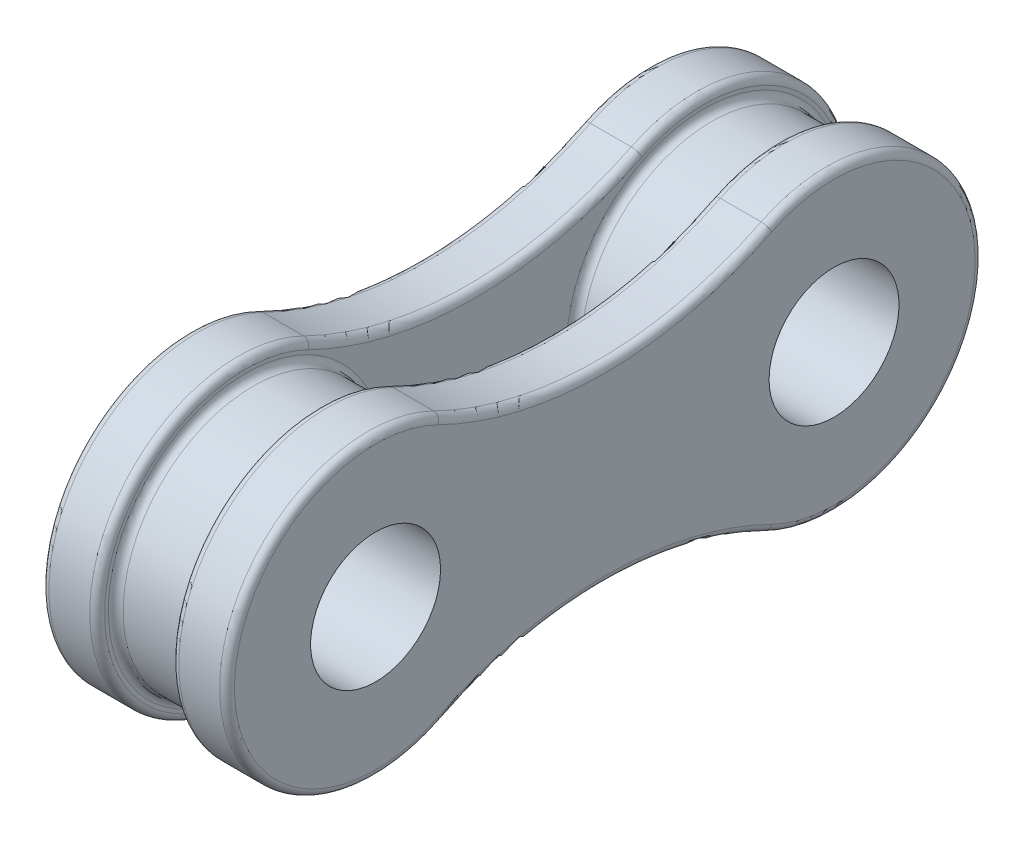
ISO-10303-21;
HEADER;
FILE_DESCRIPTION(('STEP AP214'),'2;1');
FILE_NAME('part.step','',(''),(''),'','','');
FILE_SCHEMA(('AUTOMOTIVE_DESIGN { 1 0 10303 214 1 1 1 1 }'));
ENDSEC;
DATA;
#1=APPLICATION_CONTEXT('core data for automotive mechanical design processes');
#2=APPLICATION_PROTOCOL_DEFINITION('international standard','automotive_design',2000,#1);
#3=PRODUCT_CONTEXT('',#1,'mechanical');
#4=PRODUCT('Part','Part','',(#3));
#5=PRODUCT_RELATED_PRODUCT_CATEGORY('part','',(#4));
#6=PRODUCT_DEFINITION_FORMATION('','',#4);
#7=PRODUCT_DEFINITION_CONTEXT('part definition',#1,'design');
#8=PRODUCT_DEFINITION('design','',#6,#7);
#9=PRODUCT_DEFINITION_SHAPE('','',#8);
#10=(LENGTH_UNIT() NAMED_UNIT(*) SI_UNIT(.MILLI.,.METRE.));
#11=(NAMED_UNIT(*) PLANE_ANGLE_UNIT() SI_UNIT($,.RADIAN.));
#12=(NAMED_UNIT(*) SI_UNIT($,.STERADIAN.) SOLID_ANGLE_UNIT());
#13=UNCERTAINTY_MEASURE_WITH_UNIT(LENGTH_MEASURE(1.E-05),#10,'distance_accuracy_value','');
#14=(GEOMETRIC_REPRESENTATION_CONTEXT(3) GLOBAL_UNCERTAINTY_ASSIGNED_CONTEXT((#13)) GLOBAL_UNIT_ASSIGNED_CONTEXT((#10,
#11,#12)) REPRESENTATION_CONTEXT('',''));
#15=CARTESIAN_POINT('',(0.,0.,0.));
#16=DIRECTION('',(0.,0.,1.));
#17=DIRECTION('',(1.,0.,0.));
#18=AXIS2_PLACEMENT_3D('',#15,#16,#17);
#19=CARTESIAN_POINT('',(2.5,6.2823040160438,-3.0875));
#20=DIRECTION('',(1.,0.,0.));
#21=DIRECTION('',(0.,0.,-1.));
#22=AXIS2_PLACEMENT_3D('',#19,#20,#21);
#23=PLANE('',#22);
#24=CARTESIAN_POINT('',(2.5,-12.5646080320876,0.));
#25=DIRECTION('',(1.,0.,0.));
#26=DIRECTION('',(0.,0.,-1.));
#27=AXIS2_PLACEMENT_3D('',#24,#25,#26);
#28=CIRCLE('',#27,10.2);
#29=CARTESIAN_POINT('',(2.5,-3.41039360870949,4.49892857142857));
#30=VERTEX_POINT('',#29);
#31=CARTESIAN_POINT('',(2.5,-3.41039360870949,-4.49892857142857));
#32=VERTEX_POINT('',#31);
#33=EDGE_CURVE('E191',#30,#32,#28,.F.);
#34=ORIENTED_EDGE('',*,*,#33,.T.);
#35=CARTESIAN_POINT('',(2.5,0.,-6.175));
#36=DIRECTION('',(1.,0.,0.));
#37=DIRECTION('',(0.,0.,-1.));
#38=AXIS2_PLACEMENT_3D('',#35,#36,#37);
#39=CIRCLE('',#38,3.8);
#40=CARTESIAN_POINT('',(2.5,3.41039360870949,-4.49892857142857));
#41=VERTEX_POINT('',#40);
#42=EDGE_CURVE('E171',#32,#41,#39,.T.);
#43=ORIENTED_EDGE('',*,*,#42,.T.);
#44=CARTESIAN_POINT('',(2.5,12.5646080320876,0.));
#45=DIRECTION('',(1.,0.,0.));
#46=DIRECTION('',(0.,0.,-1.));
#47=AXIS2_PLACEMENT_3D('',#44,#45,#46);
#48=CIRCLE('',#47,10.2);
#49=CARTESIAN_POINT('',(2.5,3.41039360870949,4.49892857142857));
#50=VERTEX_POINT('',#49);
#51=EDGE_CURVE('E180',#41,#50,#48,.F.);
#52=ORIENTED_EDGE('',*,*,#51,.T.);
#53=CARTESIAN_POINT('',(2.5,0.,6.175));
#54=DIRECTION('',(1.,0.,0.));
#55=DIRECTION('',(0.,0.,-1.));
#56=AXIS2_PLACEMENT_3D('',#53,#54,#55);
#57=CIRCLE('',#56,3.8);
#58=EDGE_CURVE('E186',#50,#30,#57,.T.);
#59=ORIENTED_EDGE('',*,*,#58,.T.);
#60=EDGE_LOOP('',(#34,#43,#52,#59));
#61=FACE_BOUND('',#60,.T.);
#62=CARTESIAN_POINT('',(2.5,0.,6.175));
#63=DIRECTION('',(1.,0.,0.));
#64=DIRECTION('',(0.,0.,-1.));
#65=AXIS2_PLACEMENT_3D('',#62,#63,#64);
#66=CIRCLE('',#65,1.75);
#67=CARTESIAN_POINT('',(2.5,0.,4.425));
#68=VERTEX_POINT('',#67);
#69=EDGE_CURVE('E641',#68,#68,#66,.T.);
#70=ORIENTED_EDGE('',*,*,#69,.F.);
#71=EDGE_LOOP('',(#70));
#72=FACE_BOUND('',#71,.T.);
#73=CARTESIAN_POINT('',(2.5,0.,-6.175));
#74=DIRECTION('',(1.,0.,0.));
#75=DIRECTION('',(0.,0.,1.));
#76=AXIS2_PLACEMENT_3D('',#73,#74,#75);
#77=CIRCLE('',#76,1.75);
#78=CARTESIAN_POINT('',(2.5,0.,-4.425));
#79=VERTEX_POINT('',#78);
#80=EDGE_CURVE('E643',#79,#79,#77,.T.);
#81=ORIENTED_EDGE('',*,*,#80,.F.);
#82=EDGE_LOOP('',(#81));
#83=FACE_BOUND('',#82,.T.);
#84=ADVANCED_FACE('F51',(#61,#72,#83),#23,.T.);
#85=CARTESIAN_POINT('',(1.,6.2823040160438,-3.0875));
#86=DIRECTION('',(1.,0.,0.));
#87=DIRECTION('',(0.,0.,-1.));
#88=AXIS2_PLACEMENT_3D('',#85,#86,#87);
#89=PLANE('',#88);
#90=CARTESIAN_POINT('',(1.,-12.5646080320876,0.));
#91=DIRECTION('',(1.,0.,0.));
#92=DIRECTION('',(0.,0.,-1.));
#93=AXIS2_PLACEMENT_3D('',#90,#91,#92);
#94=CIRCLE('',#93,10.2);
#95=CARTESIAN_POINT('',(1.,-3.41039360870949,-4.49892857142857));
#96=VERTEX_POINT('',#95);
#97=CARTESIAN_POINT('',(1.,-3.41039360870949,4.49892857142857));
#98=VERTEX_POINT('',#97);
#99=EDGE_CURVE('E219',#96,#98,#94,.T.);
#100=ORIENTED_EDGE('',*,*,#99,.T.);
#101=CARTESIAN_POINT('',(1.,0.,6.175));
#102=DIRECTION('',(1.,0.,0.));
#103=DIRECTION('',(0.,0.,-1.));
#104=AXIS2_PLACEMENT_3D('',#101,#102,#103);
#105=CIRCLE('',#104,3.8);
#106=CARTESIAN_POINT('',(1.,3.41039360870949,4.49892857142857));
#107=VERTEX_POINT('',#106);
#108=EDGE_CURVE('E221',#98,#107,#105,.F.);
#109=ORIENTED_EDGE('',*,*,#108,.T.);
#110=CARTESIAN_POINT('',(1.,12.5646080320876,0.));
#111=DIRECTION('',(1.,0.,0.));
#112=DIRECTION('',(0.,0.,-1.));
#113=AXIS2_PLACEMENT_3D('',#110,#111,#112);
#114=CIRCLE('',#113,10.2);
#115=CARTESIAN_POINT('',(1.,3.41039360870949,-4.49892857142857));
#116=VERTEX_POINT('',#115);
#117=EDGE_CURVE('E215',#107,#116,#114,.T.);
#118=ORIENTED_EDGE('',*,*,#117,.T.);
#119=CARTESIAN_POINT('',(1.,0.,-6.175));
#120=DIRECTION('',(1.,0.,0.));
#121=DIRECTION('',(0.,0.,-1.));
#122=AXIS2_PLACEMENT_3D('',#119,#120,#121);
#123=CIRCLE('',#122,3.8);
#124=EDGE_CURVE('E217',#116,#96,#123,.F.);
#125=ORIENTED_EDGE('',*,*,#124,.T.);
#126=EDGE_LOOP('',(#100,#109,#118,#125));
#127=FACE_BOUND('',#126,.T.);
#128=CARTESIAN_POINT('',(1.,0.,-6.175));
#129=DIRECTION('',(1.,0.,0.));
#130=DIRECTION('',(0.,0.,-1.));
#131=AXIS2_PLACEMENT_3D('',#128,#129,#130);
#132=CIRCLE('',#131,3.7);
#133=CARTESIAN_POINT('',(1.,0.,-9.875));
#134=VERTEX_POINT('',#133);
#135=EDGE_CURVE('E212',#134,#134,#132,.T.);
#136=ORIENTED_EDGE('',*,*,#135,.T.);
#137=EDGE_LOOP('',(#136));
#138=FACE_BOUND('',#137,.T.);
#139=CARTESIAN_POINT('',(1.,0.,6.175));
#140=DIRECTION('',(1.,0.,0.));
#141=DIRECTION('',(0.,0.,-1.));
#142=AXIS2_PLACEMENT_3D('',#139,#140,#141);
#143=CIRCLE('',#142,3.7);
#144=CARTESIAN_POINT('',(1.,0.,2.475));
#145=VERTEX_POINT('',#144);
#146=EDGE_CURVE('E209',#145,#145,#143,.T.);
#147=ORIENTED_EDGE('',*,*,#146,.T.);
#148=EDGE_LOOP('',(#147));
#149=FACE_BOUND('',#148,.T.);
#150=ADVANCED_FACE('F353',(#127,#138,#149),#89,.F.);
#151=CARTESIAN_POINT('',(2.5,12.5646080320876,0.));
#152=DIRECTION('',(-1.,0.,0.));
#153=DIRECTION('',(0.,0.,1.));
#154=AXIS2_PLACEMENT_3D('',#151,#152,#153);
#155=CYLINDRICAL_SURFACE('',#154,10.);
#156=DIRECTION('',(-1.,0.,0.));
#157=VECTOR('',#156,1.);
#158=CARTESIAN_POINT('',(2.5,3.58988800916788,-4.41071428571429));
#159=LINE('',#158,#157);
#160=CARTESIAN_POINT('',(2.3,3.58988800916788,-4.41071428571429));
#161=VERTEX_POINT('',#160);
#162=CARTESIAN_POINT('',(1.2,3.58988800916788,-4.41071428571429));
#163=VERTEX_POINT('',#162);
#164=EDGE_CURVE('E642',#161,#163,#159,.T.);
#165=ORIENTED_EDGE('',*,*,#164,.T.);
#166=CARTESIAN_POINT('',(1.2,12.5646080320876,0.));
#167=DIRECTION('',(1.,0.,0.));
#168=DIRECTION('',(0.,0.,-1.));
#169=AXIS2_PLACEMENT_3D('',#166,#167,#168);
#170=CIRCLE('',#169,10.);
#171=CARTESIAN_POINT('',(1.2,3.58988800916788,4.41071428571429));
#172=VERTEX_POINT('',#171);
#173=EDGE_CURVE('E226',#163,#172,#170,.F.);
#174=ORIENTED_EDGE('',*,*,#173,.T.);
#175=DIRECTION('',(-1.,0.,0.));
#176=VECTOR('',#175,1.);
#177=CARTESIAN_POINT('',(2.5,3.58988800916788,4.41071428571429));
#178=LINE('',#177,#176);
#179=CARTESIAN_POINT('',(2.3,3.58988800916788,4.41071428571429));
#180=VERTEX_POINT('',#179);
#181=EDGE_CURVE('E187',#180,#172,#178,.T.);
#182=ORIENTED_EDGE('',*,*,#181,.F.);
#183=CARTESIAN_POINT('',(2.3,12.5646080320876,0.));
#184=DIRECTION('',(1.,0.,0.));
#185=DIRECTION('',(0.,0.,-1.));
#186=AXIS2_PLACEMENT_3D('',#183,#184,#185);
#187=CIRCLE('',#186,10.);
#188=EDGE_CURVE('E224',#180,#161,#187,.T.);
#189=ORIENTED_EDGE('',*,*,#188,.T.);
#190=EDGE_LOOP('',(#165,#174,#182,#189));
#191=FACE_BOUND('',#190,.T.);
#192=ADVANCED_FACE('F358',(#191),#155,.F.);
#193=CARTESIAN_POINT('',(2.5,0.,6.175));
#194=DIRECTION('',(-1.,0.,0.));
#195=DIRECTION('',(0.,0.,1.));
#196=AXIS2_PLACEMENT_3D('',#193,#194,#195);
#197=CYLINDRICAL_SURFACE('',#196,4.);
#198=DIRECTION('',(-1.,0.,0.));
#199=VECTOR('',#198,1.);
#200=CARTESIAN_POINT('',(2.5,-3.58988800916788,4.41071428571429));
#201=LINE('',#200,#199);
#202=CARTESIAN_POINT('',(2.3,-3.58988800916788,4.41071428571429));
#203=VERTEX_POINT('',#202);
#204=CARTESIAN_POINT('',(1.2,-3.58988800916788,4.41071428571429));
#205=VERTEX_POINT('',#204);
#206=EDGE_CURVE('E655',#203,#205,#201,.T.);
#207=ORIENTED_EDGE('',*,*,#206,.F.);
#208=CARTESIAN_POINT('',(2.3,0.,6.175));
#209=DIRECTION('',(1.,0.,0.));
#210=DIRECTION('',(0.,0.,-1.));
#211=AXIS2_PLACEMENT_3D('',#208,#209,#210);
#212=CIRCLE('',#211,4.);
#213=EDGE_CURVE('E207',#203,#180,#212,.F.);
#214=ORIENTED_EDGE('',*,*,#213,.T.);
#215=ORIENTED_EDGE('',*,*,#181,.T.);
#216=CARTESIAN_POINT('',(1.2,0.,6.175));
#217=DIRECTION('',(1.,0.,0.));
#218=DIRECTION('',(0.,0.,-1.));
#219=AXIS2_PLACEMENT_3D('',#216,#217,#218);
#220=CIRCLE('',#219,4.);
#221=EDGE_CURVE('E204',#172,#205,#220,.T.);
#222=ORIENTED_EDGE('',*,*,#221,.T.);
#223=EDGE_LOOP('',(#207,#214,#215,#222));
#224=FACE_BOUND('',#223,.T.);
#225=ADVANCED_FACE('F372',(#224),#197,.T.);
#226=CARTESIAN_POINT('',(2.5,-12.5646080320876,0.));
#227=DIRECTION('',(-1.,0.,0.));
#228=DIRECTION('',(0.,0.,1.));
#229=AXIS2_PLACEMENT_3D('',#226,#227,#228);
#230=CYLINDRICAL_SURFACE('',#229,10.);
#231=DIRECTION('',(-1.,0.,0.));
#232=VECTOR('',#231,1.);
#233=CARTESIAN_POINT('',(2.5,-3.58988800916788,-4.41071428571429));
#234=LINE('',#233,#232);
#235=CARTESIAN_POINT('',(2.3,-3.58988800916788,-4.41071428571429));
#236=VERTEX_POINT('',#235);
#237=CARTESIAN_POINT('',(1.2,-3.58988800916788,-4.41071428571429));
#238=VERTEX_POINT('',#237);
#239=EDGE_CURVE('E646',#236,#238,#234,.T.);
#240=ORIENTED_EDGE('',*,*,#239,.F.);
#241=CARTESIAN_POINT('',(2.3,-12.5646080320876,0.));
#242=DIRECTION('',(1.,0.,0.));
#243=DIRECTION('',(0.,0.,-1.));
#244=AXIS2_PLACEMENT_3D('',#241,#242,#243);
#245=CIRCLE('',#244,10.);
#246=EDGE_CURVE('E202',#236,#203,#245,.T.);
#247=ORIENTED_EDGE('',*,*,#246,.T.);
#248=ORIENTED_EDGE('',*,*,#206,.T.);
#249=CARTESIAN_POINT('',(1.2,-12.5646080320876,0.));
#250=DIRECTION('',(1.,0.,0.));
#251=DIRECTION('',(0.,0.,-1.));
#252=AXIS2_PLACEMENT_3D('',#249,#250,#251);
#253=CIRCLE('',#252,10.);
#254=EDGE_CURVE('E200',#205,#238,#253,.F.);
#255=ORIENTED_EDGE('',*,*,#254,.T.);
#256=EDGE_LOOP('',(#240,#247,#248,#255));
#257=FACE_BOUND('',#256,.T.);
#258=ADVANCED_FACE('F368',(#257),#230,.F.);
#259=CARTESIAN_POINT('',(2.5,0.,-6.175));
#260=DIRECTION('',(-1.,0.,0.));
#261=DIRECTION('',(0.,0.,1.));
#262=AXIS2_PLACEMENT_3D('',#259,#260,#261);
#263=CYLINDRICAL_SURFACE('',#262,4.);
#264=ORIENTED_EDGE('',*,*,#164,.F.);
#265=CARTESIAN_POINT('',(2.3,0.,-6.175));
#266=DIRECTION('',(1.,0.,0.));
#267=DIRECTION('',(0.,0.,-1.));
#268=AXIS2_PLACEMENT_3D('',#265,#266,#267);
#269=CIRCLE('',#268,4.);
#270=EDGE_CURVE('E173',#161,#236,#269,.F.);
#271=ORIENTED_EDGE('',*,*,#270,.T.);
#272=ORIENTED_EDGE('',*,*,#239,.T.);
#273=CARTESIAN_POINT('',(1.2,0.,-6.175));
#274=DIRECTION('',(1.,0.,0.));
#275=DIRECTION('',(0.,0.,-1.));
#276=AXIS2_PLACEMENT_3D('',#273,#274,#275);
#277=CIRCLE('',#276,4.);
#278=EDGE_CURVE('E193',#238,#163,#277,.T.);
#279=ORIENTED_EDGE('',*,*,#278,.T.);
#280=EDGE_LOOP('',(#264,#271,#272,#279));
#281=FACE_BOUND('',#280,.T.);
#282=ADVANCED_FACE('F365',(#281),#263,.T.);
#283=CARTESIAN_POINT('',(2.5,0.,6.175));
#284=DIRECTION('',(-1.,0.,0.));
#285=DIRECTION('',(0.,0.,1.));
#286=AXIS2_PLACEMENT_3D('',#283,#284,#285);
#287=CYLINDRICAL_SURFACE('',#286,1.75);
#288=CARTESIAN_POINT('',(-2.3,0.,6.175));
#289=DIRECTION('',(1.,0.,0.));
#290=DIRECTION('',(0.,0.,-1.));
#291=AXIS2_PLACEMENT_3D('',#288,#289,#290);
#292=CIRCLE('',#291,1.75);
#293=CARTESIAN_POINT('',(-2.3,0.,4.425));
#294=VERTEX_POINT('',#293);
#295=EDGE_CURVE('E12',#294,#294,#292,.F.);
#296=ORIENTED_EDGE('',*,*,#295,.T.);
#297=EDGE_LOOP('',(#296));
#298=FACE_BOUND('',#297,.T.);
#299=ORIENTED_EDGE('',*,*,#69,.T.);
#300=EDGE_LOOP('',(#299));
#301=FACE_BOUND('',#300,.T.);
#302=ADVANCED_FACE('F362',(#298,#301),#287,.F.);
#303=CARTESIAN_POINT('',(2.5,0.,-6.175));
#304=DIRECTION('',(-1.,0.,0.));
#305=DIRECTION('',(0.,0.,1.));
#306=AXIS2_PLACEMENT_3D('',#303,#304,#305);
#307=CYLINDRICAL_SURFACE('',#306,1.75);
#308=CARTESIAN_POINT('',(-2.3,0.,-6.175));
#309=DIRECTION('',(1.,0.,0.));
#310=DIRECTION('',(0.,0.,-1.));
#311=AXIS2_PLACEMENT_3D('',#308,#309,#310);
#312=CIRCLE('',#311,1.75);
#313=CARTESIAN_POINT('',(-2.3,0.,-7.925));
#314=VERTEX_POINT('',#313);
#315=EDGE_CURVE('E60',#314,#314,#312,.F.);
#316=ORIENTED_EDGE('',*,*,#315,.T.);
#317=EDGE_LOOP('',(#316));
#318=FACE_BOUND('',#317,.T.);
#319=ORIENTED_EDGE('',*,*,#80,.T.);
#320=EDGE_LOOP('',(#319));
#321=FACE_BOUND('',#320,.T.);
#322=ADVANCED_FACE('F590',(#318,#321),#307,.F.);
#323=CARTESIAN_POINT('',(-2.502,0.,-6.175));
#324=DIRECTION('',(1.,0.,0.));
#325=DIRECTION('',(0.,0.,-1.));
#326=AXIS2_PLACEMENT_3D('',#323,#324,#325);
#327=CYLINDRICAL_SURFACE('',#326,3.5);
#328=CARTESIAN_POINT('',(0.8,0.,-6.175));
#329=DIRECTION('',(1.,0.,0.));
#330=DIRECTION('',(0.,0.,-1.));
#331=AXIS2_PLACEMENT_3D('',#328,#329,#330);
#332=CIRCLE('',#331,3.5);
#333=CARTESIAN_POINT('',(0.8,0.,-9.675));
#334=VERTEX_POINT('',#333);
#335=EDGE_CURVE('E231',#334,#334,#332,.F.);
#336=ORIENTED_EDGE('',*,*,#335,.T.);
#337=EDGE_LOOP('',(#336));
#338=FACE_BOUND('',#337,.T.);
#339=CARTESIAN_POINT('',(-0.8,0.,-6.175));
#340=DIRECTION('',(1.,0.,0.));
#341=DIRECTION('',(0.,0.,-1.));
#342=AXIS2_PLACEMENT_3D('',#339,#340,#341);
#343=CIRCLE('',#342,3.5);
#344=CARTESIAN_POINT('',(-0.8,0.,-9.675));
#345=VERTEX_POINT('',#344);
#346=EDGE_CURVE('E228',#345,#345,#343,.T.);
#347=ORIENTED_EDGE('',*,*,#346,.T.);
#348=EDGE_LOOP('',(#347));
#349=FACE_BOUND('',#348,.T.);
#350=ADVANCED_FACE('F582',(#338,#349),#327,.T.);
#351=CARTESIAN_POINT('',(-2.5,0.,6.175));
#352=DIRECTION('',(1.,0.,0.));
#353=DIRECTION('',(0.,0.,-1.));
#354=AXIS2_PLACEMENT_3D('',#351,#352,#353);
#355=CYLINDRICAL_SURFACE('',#354,4.);
#356=DIRECTION('',(1.,0.,0.));
#357=VECTOR('',#356,1.);
#358=CARTESIAN_POINT('',(-2.5,-3.58988800916789,4.41071428571429));
#359=LINE('',#358,#357);
#360=CARTESIAN_POINT('',(-2.3,-3.58988800916789,4.41071428571429));
#361=VERTEX_POINT('',#360);
#362=CARTESIAN_POINT('',(-1.2,-3.58988800916789,4.41071428571429));
#363=VERTEX_POINT('',#362);
#364=EDGE_CURVE('E292',#361,#363,#359,.T.);
#365=ORIENTED_EDGE('',*,*,#364,.T.);
#366=CARTESIAN_POINT('',(-1.2,0.,6.175));
#367=DIRECTION('',(1.,0.,0.));
#368=DIRECTION('',(0.,0.,-1.));
#369=AXIS2_PLACEMENT_3D('',#366,#367,#368);
#370=CIRCLE('',#369,4.);
#371=CARTESIAN_POINT('',(-1.2,3.58988800916788,4.41071428571429));
#372=VERTEX_POINT('',#371);
#373=EDGE_CURVE('E271',#363,#372,#370,.F.);
#374=ORIENTED_EDGE('',*,*,#373,.T.);
#375=DIRECTION('',(1.,0.,0.));
#376=VECTOR('',#375,1.);
#377=CARTESIAN_POINT('',(-2.5,3.58988800916788,4.41071428571429));
#378=LINE('',#377,#376);
#379=CARTESIAN_POINT('',(-2.3,3.58988800916788,4.41071428571429));
#380=VERTEX_POINT('',#379);
#381=EDGE_CURVE('E649',#380,#372,#378,.T.);
#382=ORIENTED_EDGE('',*,*,#381,.F.);
#383=CARTESIAN_POINT('',(-2.3,0.,6.175));
#384=DIRECTION('',(1.,0.,0.));
#385=DIRECTION('',(0.,0.,-1.));
#386=AXIS2_PLACEMENT_3D('',#383,#384,#385);
#387=CIRCLE('',#386,4.);
#388=EDGE_CURVE('E269',#380,#361,#387,.T.);
#389=ORIENTED_EDGE('',*,*,#388,.T.);
#390=EDGE_LOOP('',(#365,#374,#382,#389));
#391=FACE_BOUND('',#390,.T.);
#392=ADVANCED_FACE('F574',(#391),#355,.T.);
#393=CARTESIAN_POINT('',(-2.5,12.5646080320876,0.));
#394=DIRECTION('',(1.,0.,0.));
#395=DIRECTION('',(0.,0.,-1.));
#396=AXIS2_PLACEMENT_3D('',#393,#394,#395);
#397=CYLINDRICAL_SURFACE('',#396,10.);
#398=ORIENTED_EDGE('',*,*,#381,.T.);
#399=CARTESIAN_POINT('',(-1.2,12.5646080320876,0.));
#400=DIRECTION('',(1.,0.,0.));
#401=DIRECTION('',(0.,0.,-1.));
#402=AXIS2_PLACEMENT_3D('',#399,#400,#401);
#403=CIRCLE('',#402,10.);
#404=CARTESIAN_POINT('',(-1.2,3.58988800916788,-4.41071428571429));
#405=VERTEX_POINT('',#404);
#406=EDGE_CURVE('E257',#372,#405,#403,.T.);
#407=ORIENTED_EDGE('',*,*,#406,.T.);
#408=DIRECTION('',(1.,0.,0.));
#409=VECTOR('',#408,1.);
#410=CARTESIAN_POINT('',(-2.5,3.58988800916788,-4.41071428571429));
#411=LINE('',#410,#409);
#412=CARTESIAN_POINT('',(-2.3,3.58988800916788,-4.41071428571429));
#413=VERTEX_POINT('',#412);
#414=EDGE_CURVE('E689',#413,#405,#411,.T.);
#415=ORIENTED_EDGE('',*,*,#414,.F.);
#416=CARTESIAN_POINT('',(-2.3,12.5646080320876,0.));
#417=DIRECTION('',(1.,0.,0.));
#418=DIRECTION('',(0.,0.,-1.));
#419=AXIS2_PLACEMENT_3D('',#416,#417,#418);
#420=CIRCLE('',#419,10.);
#421=EDGE_CURVE('E255',#413,#380,#420,.F.);
#422=ORIENTED_EDGE('',*,*,#421,.T.);
#423=EDGE_LOOP('',(#398,#407,#415,#422));
#424=FACE_BOUND('',#423,.T.);
#425=ADVANCED_FACE('F566',(#424),#397,.F.);
#426=CARTESIAN_POINT('',(-2.5,0.,-6.175));
#427=DIRECTION('',(1.,0.,0.));
#428=DIRECTION('',(0.,0.,-1.));
#429=AXIS2_PLACEMENT_3D('',#426,#427,#428);
#430=CYLINDRICAL_SURFACE('',#429,4.);
#431=ORIENTED_EDGE('',*,*,#414,.T.);
#432=CARTESIAN_POINT('',(-1.2,0.,-6.175));
#433=DIRECTION('',(1.,0.,0.));
#434=DIRECTION('',(0.,0.,-1.));
#435=AXIS2_PLACEMENT_3D('',#432,#433,#434);
#436=CIRCLE('',#435,4.);
#437=CARTESIAN_POINT('',(-1.2,-3.58988800916788,-4.41071428571429));
#438=VERTEX_POINT('',#437);
#439=EDGE_CURVE('E262',#405,#438,#436,.F.);
#440=ORIENTED_EDGE('',*,*,#439,.T.);
#441=DIRECTION('',(1.,0.,0.));
#442=VECTOR('',#441,1.);
#443=CARTESIAN_POINT('',(-2.5,-3.58988800916788,-4.41071428571429));
#444=LINE('',#443,#442);
#445=CARTESIAN_POINT('',(-2.3,-3.58988800916788,-4.41071428571429));
#446=VERTEX_POINT('',#445);
#447=EDGE_CURVE('E686',#446,#438,#444,.T.);
#448=ORIENTED_EDGE('',*,*,#447,.F.);
#449=CARTESIAN_POINT('',(-2.3,0.,-6.175));
#450=DIRECTION('',(1.,0.,0.));
#451=DIRECTION('',(0.,0.,-1.));
#452=AXIS2_PLACEMENT_3D('',#449,#450,#451);
#453=CIRCLE('',#452,4.);
#454=EDGE_CURVE('E260',#446,#413,#453,.T.);
#455=ORIENTED_EDGE('',*,*,#454,.T.);
#456=EDGE_LOOP('',(#431,#440,#448,#455));
#457=FACE_BOUND('',#456,.T.);
#458=ADVANCED_FACE('F558',(#457),#430,.T.);
#459=CARTESIAN_POINT('',(-2.5,-12.5646080320876,0.));
#460=DIRECTION('',(1.,0.,0.));
#461=DIRECTION('',(0.,0.,-1.));
#462=AXIS2_PLACEMENT_3D('',#459,#460,#461);
#463=CYLINDRICAL_SURFACE('',#462,10.);
#464=ORIENTED_EDGE('',*,*,#447,.T.);
#465=CARTESIAN_POINT('',(-1.2,-12.5646080320876,0.));
#466=DIRECTION('',(1.,0.,0.));
#467=DIRECTION('',(0.,0.,-1.));
#468=AXIS2_PLACEMENT_3D('',#465,#466,#467);
#469=CIRCLE('',#468,10.);
#470=EDGE_CURVE('E267',#438,#363,#469,.T.);
#471=ORIENTED_EDGE('',*,*,#470,.T.);
#472=ORIENTED_EDGE('',*,*,#364,.F.);
#473=CARTESIAN_POINT('',(-2.3,-12.5646080320876,0.));
#474=DIRECTION('',(1.,0.,0.));
#475=DIRECTION('',(0.,0.,-1.));
#476=AXIS2_PLACEMENT_3D('',#473,#474,#475);
#477=CIRCLE('',#476,10.);
#478=EDGE_CURVE('E264',#361,#446,#477,.F.);
#479=ORIENTED_EDGE('',*,*,#478,.T.);
#480=EDGE_LOOP('',(#464,#471,#472,#479));
#481=FACE_BOUND('',#480,.T.);
#482=ADVANCED_FACE('F338',(#481),#463,.F.);
#483=CARTESIAN_POINT('',(-2.5,-6.2823040160438,3.0875));
#484=DIRECTION('',(1.,0.,0.));
#485=DIRECTION('',(0.,0.,-1.));
#486=AXIS2_PLACEMENT_3D('',#483,#484,#485);
#487=PLANE('',#486);
#488=CARTESIAN_POINT('',(-2.5,0.,-6.175));
#489=DIRECTION('',(1.,0.,0.));
#490=DIRECTION('',(0.,0.,-1.));
#491=AXIS2_PLACEMENT_3D('',#488,#489,#490);
#492=CIRCLE('',#491,3.8);
#493=CARTESIAN_POINT('',(-2.5,3.41039360870949,-4.49892857142857));
#494=VERTEX_POINT('',#493);
#495=CARTESIAN_POINT('',(-2.5,-3.41039360870949,-4.49892857142857));
#496=VERTEX_POINT('',#495);
#497=EDGE_CURVE('E68',#494,#496,#492,.F.);
#498=ORIENTED_EDGE('',*,*,#497,.T.);
#499=CARTESIAN_POINT('',(-2.5,-12.5646080320876,0.));
#500=DIRECTION('',(1.,0.,0.));
#501=DIRECTION('',(0.,0.,-1.));
#502=AXIS2_PLACEMENT_3D('',#499,#500,#501);
#503=CIRCLE('',#502,10.2);
#504=CARTESIAN_POINT('',(-2.5,-3.41039360870949,4.49892857142858));
#505=VERTEX_POINT('',#504);
#506=EDGE_CURVE('E283',#496,#505,#503,.T.);
#507=ORIENTED_EDGE('',*,*,#506,.T.);
#508=CARTESIAN_POINT('',(-2.5,0.,6.175));
#509=DIRECTION('',(1.,0.,0.));
#510=DIRECTION('',(0.,0.,-1.));
#511=AXIS2_PLACEMENT_3D('',#508,#509,#510);
#512=CIRCLE('',#511,3.8);
#513=CARTESIAN_POINT('',(-2.5,3.41039360870949,4.49892857142857));
#514=VERTEX_POINT('',#513);
#515=EDGE_CURVE('E279',#505,#514,#512,.F.);
#516=ORIENTED_EDGE('',*,*,#515,.T.);
#517=CARTESIAN_POINT('',(-2.5,12.5646080320876,0.));
#518=DIRECTION('',(1.,0.,0.));
#519=DIRECTION('',(0.,0.,-1.));
#520=AXIS2_PLACEMENT_3D('',#517,#518,#519);
#521=CIRCLE('',#520,10.2);
#522=EDGE_CURVE('E73',#514,#494,#521,.T.);
#523=ORIENTED_EDGE('',*,*,#522,.T.);
#524=EDGE_LOOP('',(#498,#507,#516,#523));
#525=FACE_BOUND('',#524,.T.);
#526=CARTESIAN_POINT('',(-2.5,0.,-6.175));
#527=DIRECTION('',(1.,0.,0.));
#528=DIRECTION('',(0.,0.,-1.));
#529=AXIS2_PLACEMENT_3D('',#526,#527,#528);
#530=CIRCLE('',#529,1.95);
#531=CARTESIAN_POINT('',(-2.5,0.,-8.125));
#532=VERTEX_POINT('',#531);
#533=EDGE_CURVE('E276',#532,#532,#530,.T.);
#534=ORIENTED_EDGE('',*,*,#533,.T.);
#535=EDGE_LOOP('',(#534));
#536=FACE_BOUND('',#535,.T.);
#537=CARTESIAN_POINT('',(-2.5,0.,6.175));
#538=DIRECTION('',(1.,0.,0.));
#539=DIRECTION('',(0.,0.,-1.));
#540=AXIS2_PLACEMENT_3D('',#537,#538,#539);
#541=CIRCLE('',#540,1.95);
#542=CARTESIAN_POINT('',(-2.5,0.,4.225));
#543=VERTEX_POINT('',#542);
#544=EDGE_CURVE('E273',#543,#543,#541,.T.);
#545=ORIENTED_EDGE('',*,*,#544,.T.);
#546=EDGE_LOOP('',(#545));
#547=FACE_BOUND('',#546,.T.);
#548=ADVANCED_FACE('F334',(#525,#536,#547),#487,.F.);
#549=CARTESIAN_POINT('',(-1.,-6.2823040160438,3.0875));
#550=DIRECTION('',(1.,0.,0.));
#551=DIRECTION('',(0.,0.,-1.));
#552=AXIS2_PLACEMENT_3D('',#549,#550,#551);
#553=PLANE('',#552);
#554=CARTESIAN_POINT('',(-1.,0.,-6.175));
#555=DIRECTION('',(1.,0.,0.));
#556=DIRECTION('',(0.,0.,-1.));
#557=AXIS2_PLACEMENT_3D('',#554,#555,#556);
#558=CIRCLE('',#557,3.8);
#559=CARTESIAN_POINT('',(-1.,-3.41039360870949,-4.49892857142857));
#560=VERTEX_POINT('',#559);
#561=CARTESIAN_POINT('',(-1.,3.41039360870949,-4.49892857142857));
#562=VERTEX_POINT('',#561);
#563=EDGE_CURVE('E250',#560,#562,#558,.T.);
#564=ORIENTED_EDGE('',*,*,#563,.T.);
#565=CARTESIAN_POINT('',(-1.,12.5646080320876,0.));
#566=DIRECTION('',(1.,0.,0.));
#567=DIRECTION('',(0.,0.,-1.));
#568=AXIS2_PLACEMENT_3D('',#565,#566,#567);
#569=CIRCLE('',#568,10.2);
#570=CARTESIAN_POINT('',(-1.,3.41039360870949,4.49892857142857));
#571=VERTEX_POINT('',#570);
#572=EDGE_CURVE('E252',#562,#571,#569,.F.);
#573=ORIENTED_EDGE('',*,*,#572,.T.);
#574=CARTESIAN_POINT('',(-1.,0.,6.175));
#575=DIRECTION('',(1.,0.,0.));
#576=DIRECTION('',(0.,0.,-1.));
#577=AXIS2_PLACEMENT_3D('',#574,#575,#576);
#578=CIRCLE('',#577,3.8);
#579=CARTESIAN_POINT('',(-1.,-3.41039360870949,4.49892857142858));
#580=VERTEX_POINT('',#579);
#581=EDGE_CURVE('E246',#571,#580,#578,.T.);
#582=ORIENTED_EDGE('',*,*,#581,.T.);
#583=CARTESIAN_POINT('',(-1.,-12.5646080320876,0.));
#584=DIRECTION('',(1.,0.,0.));
#585=DIRECTION('',(0.,0.,-1.));
#586=AXIS2_PLACEMENT_3D('',#583,#584,#585);
#587=CIRCLE('',#586,10.2);
#588=EDGE_CURVE('E248',#580,#560,#587,.F.);
#589=ORIENTED_EDGE('',*,*,#588,.T.);
#590=EDGE_LOOP('',(#564,#573,#582,#589));
#591=FACE_BOUND('',#590,.T.);
#592=CARTESIAN_POINT('',(-1.,0.,-6.175));
#593=DIRECTION('',(1.,0.,0.));
#594=DIRECTION('',(0.,0.,-1.));
#595=AXIS2_PLACEMENT_3D('',#592,#593,#594);
#596=CIRCLE('',#595,3.7);
#597=CARTESIAN_POINT('',(-1.,0.,-9.875));
#598=VERTEX_POINT('',#597);
#599=EDGE_CURVE('E243',#598,#598,#596,.F.);
#600=ORIENTED_EDGE('',*,*,#599,.T.);
#601=EDGE_LOOP('',(#600));
#602=FACE_BOUND('',#601,.T.);
#603=CARTESIAN_POINT('',(-1.,0.,6.175));
#604=DIRECTION('',(1.,0.,0.));
#605=DIRECTION('',(0.,0.,-1.));
#606=AXIS2_PLACEMENT_3D('',#603,#604,#605);
#607=CIRCLE('',#606,3.7);
#608=CARTESIAN_POINT('',(-1.,0.,2.475));
#609=VERTEX_POINT('',#608);
#610=EDGE_CURVE('E240',#609,#609,#607,.F.);
#611=ORIENTED_EDGE('',*,*,#610,.T.);
#612=EDGE_LOOP('',(#611));
#613=FACE_BOUND('',#612,.T.);
#614=ADVANCED_FACE('F337',(#591,#602,#613),#553,.T.);
#615=CARTESIAN_POINT('',(-2.502,0.,6.175));
#616=DIRECTION('',(1.,0.,0.));
#617=DIRECTION('',(0.,0.,-1.));
#618=AXIS2_PLACEMENT_3D('',#615,#616,#617);
#619=CYLINDRICAL_SURFACE('',#618,3.5);
#620=CARTESIAN_POINT('',(0.8,0.,6.175));
#621=DIRECTION('',(1.,0.,0.));
#622=DIRECTION('',(0.,0.,-1.));
#623=AXIS2_PLACEMENT_3D('',#620,#621,#622);
#624=CIRCLE('',#623,3.5);
#625=CARTESIAN_POINT('',(0.8,0.,2.675));
#626=VERTEX_POINT('',#625);
#627=EDGE_CURVE('E237',#626,#626,#624,.F.);
#628=ORIENTED_EDGE('',*,*,#627,.T.);
#629=EDGE_LOOP('',(#628));
#630=FACE_BOUND('',#629,.T.);
#631=CARTESIAN_POINT('',(-0.8,0.,6.175));
#632=DIRECTION('',(1.,0.,0.));
#633=DIRECTION('',(0.,0.,-1.));
#634=AXIS2_PLACEMENT_3D('',#631,#632,#633);
#635=CIRCLE('',#634,3.5);
#636=CARTESIAN_POINT('',(-0.8,0.,2.675));
#637=VERTEX_POINT('',#636);
#638=EDGE_CURVE('E234',#637,#637,#635,.T.);
#639=ORIENTED_EDGE('',*,*,#638,.T.);
#640=EDGE_LOOP('',(#639));
#641=FACE_BOUND('',#640,.T.);
#642=ADVANCED_FACE('F392',(#630,#641),#619,.T.);
#643=CARTESIAN_POINT('',(2.3,0.,6.175));
#644=DIRECTION('',(1.,0.,0.));
#645=DIRECTION('',(0.,0.,-1.));
#646=AXIS2_PLACEMENT_3D('',#643,#644,#645);
#647=TOROIDAL_SURFACE('',#646,3.8,0.2);
#648=CARTESIAN_POINT('',(2.3,3.41039360870949,4.49892857142857));
#649=DIRECTION('',(0.,-0.44107142857143,-0.89747200229197));
#650=DIRECTION('',(0.,0.89747200229197,-0.44107142857143));
#651=AXIS2_PLACEMENT_3D('',#648,#649,#650);
#652=CIRCLE('',#651,0.2);
#653=EDGE_CURVE('E183',#180,#50,#652,.T.);
#654=ORIENTED_EDGE('',*,*,#653,.F.);
#655=ORIENTED_EDGE('',*,*,#213,.F.);
#656=CARTESIAN_POINT('',(2.3,-3.41039360870949,4.49892857142857));
#657=DIRECTION('',(0.,0.44107142857143,-0.89747200229197));
#658=DIRECTION('',(0.,0.89747200229197,0.44107142857143));
#659=AXIS2_PLACEMENT_3D('',#656,#657,#658);
#660=CIRCLE('',#659,0.2);
#661=EDGE_CURVE('E289',#30,#203,#660,.T.);
#662=ORIENTED_EDGE('',*,*,#661,.F.);
#663=ORIENTED_EDGE('',*,*,#58,.F.);
#664=EDGE_LOOP('',(#654,#655,#662,#663));
#665=FACE_BOUND('',#664,.T.);
#666=ADVANCED_FACE('F388',(#665),#647,.T.);
#667=CARTESIAN_POINT('',(2.3,-12.5646080320876,0.));
#668=DIRECTION('',(1.,0.,0.));
#669=DIRECTION('',(0.,0.,-1.));
#670=AXIS2_PLACEMENT_3D('',#667,#668,#669);
#671=TOROIDAL_SURFACE('',#670,10.2,0.2);
#672=ORIENTED_EDGE('',*,*,#661,.T.);
#673=ORIENTED_EDGE('',*,*,#246,.F.);
#674=CARTESIAN_POINT('',(2.3,-3.41039360870949,-4.49892857142857));
#675=DIRECTION('',(0.,-0.44107142857143,-0.89747200229197));
#676=DIRECTION('',(0.,0.89747200229197,-0.44107142857143));
#677=AXIS2_PLACEMENT_3D('',#674,#675,#676);
#678=CIRCLE('',#677,0.2);
#679=EDGE_CURVE('E176',#32,#236,#678,.T.);
#680=ORIENTED_EDGE('',*,*,#679,.F.);
#681=ORIENTED_EDGE('',*,*,#33,.F.);
#682=EDGE_LOOP('',(#672,#673,#680,#681));
#683=FACE_BOUND('',#682,.T.);
#684=ADVANCED_FACE('F385',(#683),#671,.T.);
#685=CARTESIAN_POINT('',(2.3,12.5646080320876,0.));
#686=DIRECTION('',(1.,0.,0.));
#687=DIRECTION('',(0.,0.,-1.));
#688=AXIS2_PLACEMENT_3D('',#685,#686,#687);
#689=TOROIDAL_SURFACE('',#688,10.2,0.2);
#690=ORIENTED_EDGE('',*,*,#653,.T.);
#691=ORIENTED_EDGE('',*,*,#51,.F.);
#692=CARTESIAN_POINT('',(2.3,3.41039360870949,-4.49892857142857));
#693=DIRECTION('',(0.,0.44107142857143,-0.89747200229197));
#694=DIRECTION('',(0.,0.89747200229197,0.44107142857143));
#695=AXIS2_PLACEMENT_3D('',#692,#693,#694);
#696=CIRCLE('',#695,0.2);
#697=EDGE_CURVE('E167',#161,#41,#696,.T.);
#698=ORIENTED_EDGE('',*,*,#697,.F.);
#699=ORIENTED_EDGE('',*,*,#188,.F.);
#700=EDGE_LOOP('',(#690,#691,#698,#699));
#701=FACE_BOUND('',#700,.T.);
#702=ADVANCED_FACE('F181',(#701),#689,.T.);
#703=CARTESIAN_POINT('',(2.3,0.,-6.175));
#704=DIRECTION('',(1.,0.,0.));
#705=DIRECTION('',(0.,0.,-1.));
#706=AXIS2_PLACEMENT_3D('',#703,#704,#705);
#707=TOROIDAL_SURFACE('',#706,3.8,0.2);
#708=ORIENTED_EDGE('',*,*,#679,.T.);
#709=ORIENTED_EDGE('',*,*,#270,.F.);
#710=ORIENTED_EDGE('',*,*,#697,.T.);
#711=ORIENTED_EDGE('',*,*,#42,.F.);
#712=EDGE_LOOP('',(#708,#709,#710,#711));
#713=FACE_BOUND('',#712,.T.);
#714=ADVANCED_FACE('F169',(#713),#707,.T.);
#715=CARTESIAN_POINT('',(1.2,0.,-6.175));
#716=DIRECTION('',(1.,0.,0.));
#717=DIRECTION('',(0.,0.,-1.));
#718=AXIS2_PLACEMENT_3D('',#715,#716,#717);
#719=TOROIDAL_SURFACE('',#718,3.8,0.2);
#720=CARTESIAN_POINT('',(1.2,-3.41039360870949,-4.49892857142857));
#721=DIRECTION('',(0.,0.44107142857143,0.89747200229197));
#722=DIRECTION('',(0.,-0.89747200229197,0.44107142857143));
#723=AXIS2_PLACEMENT_3D('',#720,#721,#722);
#724=CIRCLE('',#723,0.2);
#725=EDGE_CURVE('E298',#96,#238,#724,.T.);
#726=ORIENTED_EDGE('',*,*,#725,.F.);
#727=ORIENTED_EDGE('',*,*,#124,.F.);
#728=CARTESIAN_POINT('',(1.2,3.41039360870949,-4.49892857142857));
#729=DIRECTION('',(0.,-0.44107142857143,0.89747200229197));
#730=DIRECTION('',(0.,-0.89747200229197,-0.44107142857143));
#731=AXIS2_PLACEMENT_3D('',#728,#729,#730);
#732=CIRCLE('',#731,0.2);
#733=EDGE_CURVE('E177',#163,#116,#732,.T.);
#734=ORIENTED_EDGE('',*,*,#733,.F.);
#735=ORIENTED_EDGE('',*,*,#278,.F.);
#736=EDGE_LOOP('',(#726,#727,#734,#735));
#737=FACE_BOUND('',#736,.T.);
#738=ADVANCED_FACE('F382',(#737),#719,.T.);
#739=CARTESIAN_POINT('',(1.2,12.5646080320876,0.));
#740=DIRECTION('',(1.,0.,0.));
#741=DIRECTION('',(0.,0.,-1.));
#742=AXIS2_PLACEMENT_3D('',#739,#740,#741);
#743=TOROIDAL_SURFACE('',#742,10.2,0.2);
#744=ORIENTED_EDGE('',*,*,#733,.T.);
#745=ORIENTED_EDGE('',*,*,#117,.F.);
#746=CARTESIAN_POINT('',(1.2,3.41039360870949,4.49892857142857));
#747=DIRECTION('',(0.,0.44107142857143,0.89747200229197));
#748=DIRECTION('',(0.,-0.89747200229197,0.44107142857143));
#749=AXIS2_PLACEMENT_3D('',#746,#747,#748);
#750=CIRCLE('',#749,0.2);
#751=EDGE_CURVE('E295',#172,#107,#750,.T.);
#752=ORIENTED_EDGE('',*,*,#751,.F.);
#753=ORIENTED_EDGE('',*,*,#173,.F.);
#754=EDGE_LOOP('',(#744,#745,#752,#753));
#755=FACE_BOUND('',#754,.T.);
#756=ADVANCED_FACE('F402',(#755),#743,.T.);
#757=CARTESIAN_POINT('',(1.2,-12.5646080320876,0.));
#758=DIRECTION('',(1.,0.,0.));
#759=DIRECTION('',(0.,0.,-1.));
#760=AXIS2_PLACEMENT_3D('',#757,#758,#759);
#761=TOROIDAL_SURFACE('',#760,10.2,0.2);
#762=ORIENTED_EDGE('',*,*,#725,.T.);
#763=ORIENTED_EDGE('',*,*,#254,.F.);
#764=CARTESIAN_POINT('',(1.2,-3.41039360870949,4.49892857142857));
#765=DIRECTION('',(0.,-0.441071428571426,0.897472002291972));
#766=DIRECTION('',(0.,-0.897472002291972,-0.441071428571426));
#767=AXIS2_PLACEMENT_3D('',#764,#765,#766);
#768=CIRCLE('',#767,0.2);
#769=EDGE_CURVE('E293',#98,#205,#768,.T.);
#770=ORIENTED_EDGE('',*,*,#769,.F.);
#771=ORIENTED_EDGE('',*,*,#99,.F.);
#772=EDGE_LOOP('',(#762,#763,#770,#771));
#773=FACE_BOUND('',#772,.T.);
#774=ADVANCED_FACE('F398',(#773),#761,.T.);
#775=CARTESIAN_POINT('',(1.2,0.,6.175));
#776=DIRECTION('',(1.,0.,0.));
#777=DIRECTION('',(0.,0.,-1.));
#778=AXIS2_PLACEMENT_3D('',#775,#776,#777);
#779=TOROIDAL_SURFACE('',#778,3.8,0.2);
#780=ORIENTED_EDGE('',*,*,#751,.T.);
#781=ORIENTED_EDGE('',*,*,#108,.F.);
#782=ORIENTED_EDGE('',*,*,#769,.T.);
#783=ORIENTED_EDGE('',*,*,#221,.F.);
#784=EDGE_LOOP('',(#780,#781,#782,#783));
#785=FACE_BOUND('',#784,.T.);
#786=ADVANCED_FACE('F394',(#785),#779,.T.);
#787=CARTESIAN_POINT('',(0.8,0.,-6.175));
#788=DIRECTION('',(1.,0.,0.));
#789=DIRECTION('',(0.,0.,-1.));
#790=AXIS2_PLACEMENT_3D('',#787,#788,#789);
#791=TOROIDAL_SURFACE('',#790,3.7,0.2);
#792=ORIENTED_EDGE('',*,*,#335,.F.);
#793=EDGE_LOOP('',(#792));
#794=FACE_BOUND('',#793,.T.);
#795=ORIENTED_EDGE('',*,*,#135,.F.);
#796=EDGE_LOOP('',(#795));
#797=FACE_BOUND('',#796,.T.);
#798=ADVANCED_FACE('F397',(#794,#797),#791,.F.);
#799=CARTESIAN_POINT('',(0.8,0.,6.175));
#800=DIRECTION('',(1.,0.,0.));
#801=DIRECTION('',(0.,0.,-1.));
#802=AXIS2_PLACEMENT_3D('',#799,#800,#801);
#803=TOROIDAL_SURFACE('',#802,3.7,0.2);
#804=ORIENTED_EDGE('',*,*,#627,.F.);
#805=EDGE_LOOP('',(#804));
#806=FACE_BOUND('',#805,.T.);
#807=ORIENTED_EDGE('',*,*,#146,.F.);
#808=EDGE_LOOP('',(#807));
#809=FACE_BOUND('',#808,.T.);
#810=ADVANCED_FACE('F412',(#806,#809),#803,.F.);
#811=CARTESIAN_POINT('',(-1.2,-12.5646080320876,0.));
#812=DIRECTION('',(1.,0.,0.));
#813=DIRECTION('',(0.,0.,-1.));
#814=AXIS2_PLACEMENT_3D('',#811,#812,#813);
#815=TOROIDAL_SURFACE('',#814,10.2,0.2);
#816=CARTESIAN_POINT('',(-1.2,-3.41039360870949,4.49892857142858));
#817=DIRECTION('',(0.,-0.44107142857143,0.89747200229197));
#818=DIRECTION('',(0.,-0.89747200229197,-0.44107142857143));
#819=AXIS2_PLACEMENT_3D('',#816,#817,#818);
#820=CIRCLE('',#819,0.2);
#821=EDGE_CURVE('E307',#363,#580,#820,.T.);
#822=ORIENTED_EDGE('',*,*,#821,.F.);
#823=ORIENTED_EDGE('',*,*,#470,.F.);
#824=CARTESIAN_POINT('',(-1.2,-3.41039360870949,-4.49892857142857));
#825=DIRECTION('',(0.,-0.441071428571425,-0.897472002291972));
#826=DIRECTION('',(0.,0.897472002291973,-0.441071428571425));
#827=AXIS2_PLACEMENT_3D('',#824,#825,#826);
#828=CIRCLE('',#827,0.2);
#829=EDGE_CURVE('E296',#560,#438,#828,.T.);
#830=ORIENTED_EDGE('',*,*,#829,.F.);
#831=ORIENTED_EDGE('',*,*,#588,.F.);
#832=EDGE_LOOP('',(#822,#823,#830,#831));
#833=FACE_BOUND('',#832,.T.);
#834=ADVANCED_FACE('F416',(#833),#815,.T.);
#835=CARTESIAN_POINT('',(-1.2,0.,-6.175));
#836=DIRECTION('',(1.,0.,0.));
#837=DIRECTION('',(0.,0.,-1.));
#838=AXIS2_PLACEMENT_3D('',#835,#836,#837);
#839=TOROIDAL_SURFACE('',#838,3.8,0.2);
#840=ORIENTED_EDGE('',*,*,#829,.T.);
#841=ORIENTED_EDGE('',*,*,#439,.F.);
#842=CARTESIAN_POINT('',(-1.2,3.41039360870949,-4.49892857142857));
#843=DIRECTION('',(0.,-0.441071428571431,0.89747200229197));
#844=DIRECTION('',(0.,-0.89747200229197,-0.441071428571431));
#845=AXIS2_PLACEMENT_3D('',#842,#843,#844);
#846=CIRCLE('',#845,0.2);
#847=EDGE_CURVE('E305',#562,#405,#846,.T.);
#848=ORIENTED_EDGE('',*,*,#847,.F.);
#849=ORIENTED_EDGE('',*,*,#563,.F.);
#850=EDGE_LOOP('',(#840,#841,#848,#849));
#851=FACE_BOUND('',#850,.T.);
#852=ADVANCED_FACE('F426',(#851),#839,.T.);
#853=CARTESIAN_POINT('',(-1.2,0.,6.175));
#854=DIRECTION('',(1.,0.,0.));
#855=DIRECTION('',(0.,0.,-1.));
#856=AXIS2_PLACEMENT_3D('',#853,#854,#855);
#857=TOROIDAL_SURFACE('',#856,3.8,0.2);
#858=ORIENTED_EDGE('',*,*,#821,.T.);
#859=ORIENTED_EDGE('',*,*,#581,.F.);
#860=CARTESIAN_POINT('',(-1.2,3.41039360870949,4.49892857142857));
#861=DIRECTION('',(0.,-0.44107142857143,-0.89747200229197));
#862=DIRECTION('',(0.,0.89747200229197,-0.44107142857143));
#863=AXIS2_PLACEMENT_3D('',#860,#861,#862);
#864=CIRCLE('',#863,0.2);
#865=EDGE_CURVE('E303',#372,#571,#864,.T.);
#866=ORIENTED_EDGE('',*,*,#865,.F.);
#867=ORIENTED_EDGE('',*,*,#373,.F.);
#868=EDGE_LOOP('',(#858,#859,#866,#867));
#869=FACE_BOUND('',#868,.T.);
#870=ADVANCED_FACE('F422',(#869),#857,.T.);
#871=CARTESIAN_POINT('',(-1.2,12.5646080320876,0.));
#872=DIRECTION('',(1.,0.,0.));
#873=DIRECTION('',(0.,0.,-1.));
#874=AXIS2_PLACEMENT_3D('',#871,#872,#873);
#875=TOROIDAL_SURFACE('',#874,10.2,0.2);
#876=ORIENTED_EDGE('',*,*,#847,.T.);
#877=ORIENTED_EDGE('',*,*,#406,.F.);
#878=ORIENTED_EDGE('',*,*,#865,.T.);
#879=ORIENTED_EDGE('',*,*,#572,.F.);
#880=EDGE_LOOP('',(#876,#877,#878,#879));
#881=FACE_BOUND('',#880,.T.);
#882=ADVANCED_FACE('F418',(#881),#875,.T.);
#883=CARTESIAN_POINT('',(-0.8,0.,-6.175));
#884=DIRECTION('',(1.,0.,0.));
#885=DIRECTION('',(0.,0.,-1.));
#886=AXIS2_PLACEMENT_3D('',#883,#884,#885);
#887=TOROIDAL_SURFACE('',#886,3.7,0.2);
#888=ORIENTED_EDGE('',*,*,#346,.F.);
#889=EDGE_LOOP('',(#888));
#890=FACE_BOUND('',#889,.T.);
#891=ORIENTED_EDGE('',*,*,#599,.F.);
#892=EDGE_LOOP('',(#891));
#893=FACE_BOUND('',#892,.T.);
#894=ADVANCED_FACE('F421',(#890,#893),#887,.F.);
#895=CARTESIAN_POINT('',(-0.8,0.,6.175));
#896=DIRECTION('',(1.,0.,0.));
#897=DIRECTION('',(0.,0.,-1.));
#898=AXIS2_PLACEMENT_3D('',#895,#896,#897);
#899=TOROIDAL_SURFACE('',#898,3.7,0.2);
#900=ORIENTED_EDGE('',*,*,#610,.F.);
#901=EDGE_LOOP('',(#900));
#902=FACE_BOUND('',#901,.T.);
#903=ORIENTED_EDGE('',*,*,#638,.F.);
#904=EDGE_LOOP('',(#903));
#905=FACE_BOUND('',#904,.T.);
#906=ADVANCED_FACE('F436',(#902,#905),#899,.F.);
#907=CARTESIAN_POINT('',(-2.3,12.5646080320876,0.));
#908=DIRECTION('',(1.,0.,0.));
#909=DIRECTION('',(0.,0.,-1.));
#910=AXIS2_PLACEMENT_3D('',#907,#908,#909);
#911=TOROIDAL_SURFACE('',#910,10.2,0.2);
#912=CARTESIAN_POINT('',(-2.3,3.41039360870949,-4.49892857142857));
#913=DIRECTION('',(0.,0.44107142857143,-0.89747200229197));
#914=DIRECTION('',(0.,0.89747200229197,0.44107142857143));
#915=AXIS2_PLACEMENT_3D('',#912,#913,#914);
#916=CIRCLE('',#915,0.2);
#917=EDGE_CURVE('E315',#494,#413,#916,.T.);
#918=ORIENTED_EDGE('',*,*,#917,.F.);
#919=ORIENTED_EDGE('',*,*,#522,.F.);
#920=CARTESIAN_POINT('',(-2.3,3.41039360870949,4.49892857142857));
#921=DIRECTION('',(0.,0.441071428571426,0.897472002291972));
#922=DIRECTION('',(0.,-0.897472002291972,0.441071428571426));
#923=AXIS2_PLACEMENT_3D('',#920,#921,#922);
#924=CIRCLE('',#923,0.2);
#925=EDGE_CURVE('E55',#380,#514,#924,.T.);
#926=ORIENTED_EDGE('',*,*,#925,.F.);
#927=ORIENTED_EDGE('',*,*,#421,.F.);
#928=EDGE_LOOP('',(#918,#919,#926,#927));
#929=FACE_BOUND('',#928,.T.);
#930=ADVANCED_FACE('F328',(#929),#911,.T.);
#931=CARTESIAN_POINT('',(-2.3,0.,6.175));
#932=DIRECTION('',(1.,0.,0.));
#933=DIRECTION('',(0.,0.,-1.));
#934=AXIS2_PLACEMENT_3D('',#931,#932,#933);
#935=TOROIDAL_SURFACE('',#934,3.8,0.2);
#936=ORIENTED_EDGE('',*,*,#925,.T.);
#937=ORIENTED_EDGE('',*,*,#515,.F.);
#938=CARTESIAN_POINT('',(-2.3,-3.41039360870949,4.49892857142858));
#939=DIRECTION('',(0.,0.441071428571426,-0.897472002291972));
#940=DIRECTION('',(0.,0.897472002291972,0.441071428571426));
#941=AXIS2_PLACEMENT_3D('',#938,#939,#940);
#942=CIRCLE('',#941,0.2);
#943=EDGE_CURVE('E314',#361,#505,#942,.T.);
#944=ORIENTED_EDGE('',*,*,#943,.F.);
#945=ORIENTED_EDGE('',*,*,#388,.F.);
#946=EDGE_LOOP('',(#936,#937,#944,#945));
#947=FACE_BOUND('',#946,.T.);
#948=ADVANCED_FACE('F324',(#947),#935,.T.);
#949=CARTESIAN_POINT('',(-2.3,0.,-6.175));
#950=DIRECTION('',(1.,0.,0.));
#951=DIRECTION('',(0.,0.,-1.));
#952=AXIS2_PLACEMENT_3D('',#949,#950,#951);
#953=TOROIDAL_SURFACE('',#952,3.8,0.2);
#954=ORIENTED_EDGE('',*,*,#917,.T.);
#955=ORIENTED_EDGE('',*,*,#454,.F.);
#956=CARTESIAN_POINT('',(-2.3,-3.41039360870949,-4.49892857142857));
#957=DIRECTION('',(0.,0.441071428571431,0.89747200229197));
#958=DIRECTION('',(0.,-0.89747200229197,0.441071428571431));
#959=AXIS2_PLACEMENT_3D('',#956,#957,#958);
#960=CIRCLE('',#959,0.2);
#961=EDGE_CURVE('E312',#496,#446,#960,.T.);
#962=ORIENTED_EDGE('',*,*,#961,.F.);
#963=ORIENTED_EDGE('',*,*,#497,.F.);
#964=EDGE_LOOP('',(#954,#955,#962,#963));
#965=FACE_BOUND('',#964,.T.);
#966=ADVANCED_FACE('F330',(#965),#953,.T.);
#967=CARTESIAN_POINT('',(-2.3,-12.5646080320876,0.));
#968=DIRECTION('',(1.,0.,0.));
#969=DIRECTION('',(0.,0.,-1.));
#970=AXIS2_PLACEMENT_3D('',#967,#968,#969);
#971=TOROIDAL_SURFACE('',#970,10.2,0.2);
#972=ORIENTED_EDGE('',*,*,#943,.T.);
#973=ORIENTED_EDGE('',*,*,#506,.F.);
#974=ORIENTED_EDGE('',*,*,#961,.T.);
#975=ORIENTED_EDGE('',*,*,#478,.F.);
#976=EDGE_LOOP('',(#972,#973,#974,#975));
#977=FACE_BOUND('',#976,.T.);
#978=ADVANCED_FACE('F333',(#977),#971,.T.);
#979=CARTESIAN_POINT('',(-2.3,0.,-6.175));
#980=DIRECTION('',(1.,0.,0.));
#981=DIRECTION('',(0.,0.,-1.));
#982=AXIS2_PLACEMENT_3D('',#979,#980,#981);
#983=TOROIDAL_SURFACE('',#982,1.95,0.2);
#984=ORIENTED_EDGE('',*,*,#315,.F.);
#985=EDGE_LOOP('',(#984));
#986=FACE_BOUND('',#985,.T.);
#987=ORIENTED_EDGE('',*,*,#533,.F.);
#988=EDGE_LOOP('',(#987));
#989=FACE_BOUND('',#988,.T.);
#990=ADVANCED_FACE('F345',(#986,#989),#983,.T.);
#991=CARTESIAN_POINT('',(-2.3,0.,6.175));
#992=DIRECTION('',(1.,0.,0.));
#993=DIRECTION('',(0.,0.,-1.));
#994=AXIS2_PLACEMENT_3D('',#991,#992,#993);
#995=TOROIDAL_SURFACE('',#994,1.95,0.2);
#996=ORIENTED_EDGE('',*,*,#295,.F.);
#997=EDGE_LOOP('',(#996));
#998=FACE_BOUND('',#997,.T.);
#999=ORIENTED_EDGE('',*,*,#544,.F.);
#1000=EDGE_LOOP('',(#999));
#1001=FACE_BOUND('',#1000,.T.);
#1002=ADVANCED_FACE('F53',(#998,#1001),#995,.T.);
#1003=CLOSED_SHELL('',(#84,#150,#192,#225,#258,#282,#302,#322,#350,#392,#425,#458,#482,#548,
#614,#642,#666,#684,#702,#714,#738,#756,#774,#786,#798,#810,#834,#852,#870,#882,#894,#906,#930,
#948,#966,#978,#990,#1002));
#1004=MANIFOLD_SOLID_BREP('B2',#1003);
#1005=ADVANCED_BREP_SHAPE_REPRESENTATION('',(#18,#1004),#14);
#1006=SHAPE_DEFINITION_REPRESENTATION(#9,#1005);
ENDSEC;
END-ISO-10303-21;
